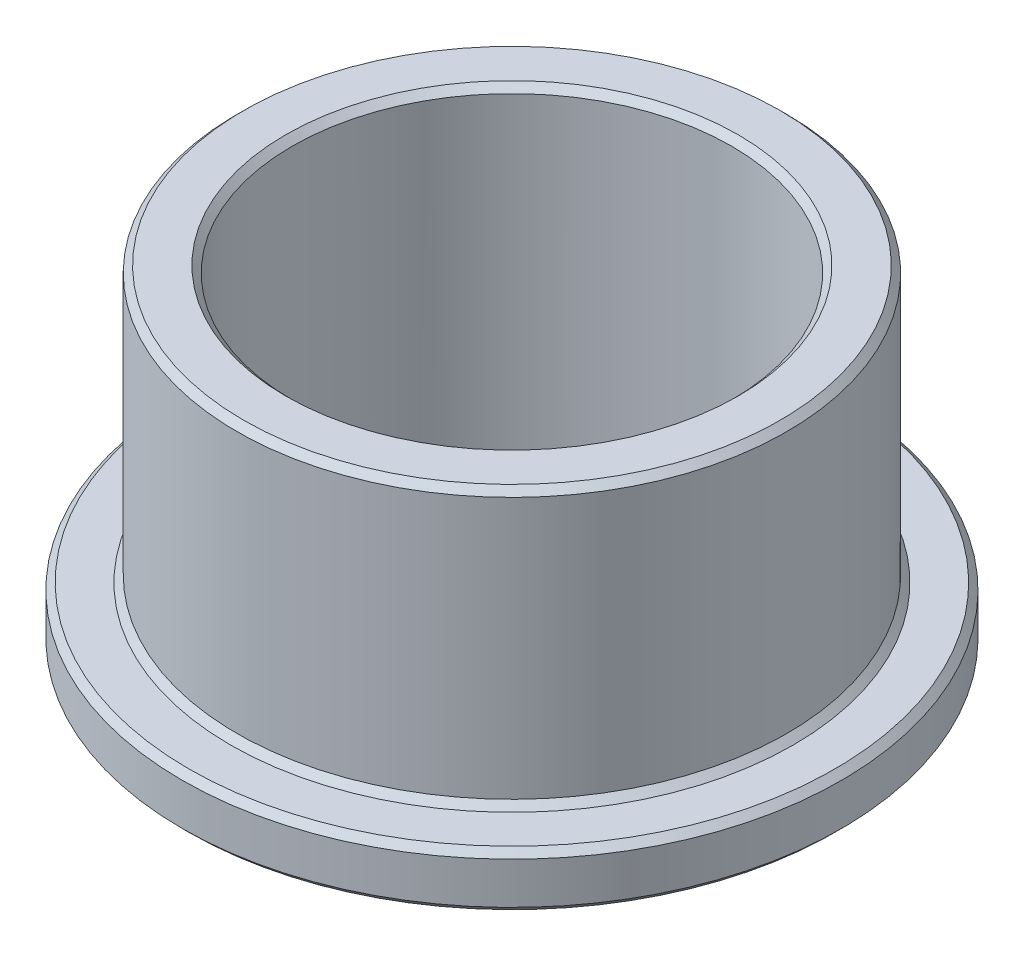
ISO-10303-21;
HEADER;
FILE_DESCRIPTION(('STEP AP214'),'2;1');
FILE_NAME('part.step','',(''),(''),'','','');
FILE_SCHEMA(('AUTOMOTIVE_DESIGN { 1 0 10303 214 1 1 1 1 }'));
ENDSEC;
DATA;
#1=APPLICATION_CONTEXT('core data for automotive mechanical design processes');
#2=APPLICATION_PROTOCOL_DEFINITION('international standard','automotive_design',2000,#1);
#3=PRODUCT_CONTEXT('',#1,'mechanical');
#4=PRODUCT('Part','Part','',(#3));
#5=PRODUCT_RELATED_PRODUCT_CATEGORY('part','',(#4));
#6=PRODUCT_DEFINITION_FORMATION('','',#4);
#7=PRODUCT_DEFINITION_CONTEXT('part definition',#1,'design');
#8=PRODUCT_DEFINITION('design','',#6,#7);
#9=PRODUCT_DEFINITION_SHAPE('','',#8);
#10=(LENGTH_UNIT() NAMED_UNIT(*) SI_UNIT(.MILLI.,.METRE.));
#11=(NAMED_UNIT(*) PLANE_ANGLE_UNIT() SI_UNIT($,.RADIAN.));
#12=(NAMED_UNIT(*) SI_UNIT($,.STERADIAN.) SOLID_ANGLE_UNIT());
#13=UNCERTAINTY_MEASURE_WITH_UNIT(LENGTH_MEASURE(1.E-05),#10,'distance_accuracy_value','');
#14=(GEOMETRIC_REPRESENTATION_CONTEXT(3) GLOBAL_UNCERTAINTY_ASSIGNED_CONTEXT((#13)) GLOBAL_UNIT_ASSIGNED_CONTEXT((#10,
#11,#12)) REPRESENTATION_CONTEXT('',''));
#15=CARTESIAN_POINT('',(0.,0.,0.));
#16=DIRECTION('',(0.,0.,1.));
#17=DIRECTION('',(1.,0.,0.));
#18=AXIS2_PLACEMENT_3D('',#15,#16,#17);
#19=CARTESIAN_POINT('',(-30.3854881364311,3.175,-94.9077592409513));
#20=DIRECTION('',(0.,-1.,0.));
#21=DIRECTION('',(0.,0.,-1.));
#22=AXIS2_PLACEMENT_3D('',#19,#20,#21);
#23=CYLINDRICAL_SURFACE('',#22,19.05);
#24=CARTESIAN_POINT('',(-30.3854881364311,0.381000000000006,-94.9077592409513));
#25=DIRECTION('',(0.,1.,0.));
#26=DIRECTION('',(0.,0.,1.));
#27=AXIS2_PLACEMENT_3D('',#24,#25,#26);
#28=CIRCLE('',#27,19.05);
#29=CARTESIAN_POINT('',(-30.3854881364311,0.381000000000006,-75.8577592409513));
#30=VERTEX_POINT('',#29);
#31=EDGE_CURVE('E72',#30,#30,#28,.T.);
#32=ORIENTED_EDGE('',*,*,#31,.T.);
#33=EDGE_LOOP('',(#32));
#34=FACE_BOUND('',#33,.T.);
#35=CARTESIAN_POINT('',(-30.3854881364311,2.79400000000001,-94.9077592409513));
#36=DIRECTION('',(0.,1.,0.));
#37=DIRECTION('',(0.,0.,1.));
#38=AXIS2_PLACEMENT_3D('',#35,#36,#37);
#39=CIRCLE('',#38,19.05);
#40=CARTESIAN_POINT('',(-30.3854881364311,2.79400000000001,-75.8577592409513));
#41=VERTEX_POINT('',#40);
#42=EDGE_CURVE('E76',#41,#41,#39,.F.);
#43=ORIENTED_EDGE('',*,*,#42,.T.);
#44=EDGE_LOOP('',(#43));
#45=FACE_BOUND('',#44,.T.);
#46=ADVANCED_FACE('F39',(#34,#45),#23,.T.);
#47=CARTESIAN_POINT('',(0.,3.175,0.));
#48=DIRECTION('',(0.,1.,0.));
#49=DIRECTION('',(0.,0.,1.));
#50=AXIS2_PLACEMENT_3D('',#47,#48,#49);
#51=PLANE('',#50);
#52=CARTESIAN_POINT('',(-30.3854881364311,3.175,-94.9077592409513));
#53=DIRECTION('',(0.,1.,0.));
#54=DIRECTION('',(0.,0.,1.));
#55=AXIS2_PLACEMENT_3D('',#52,#53,#54);
#56=CIRCLE('',#55,18.669);
#57=CARTESIAN_POINT('',(-30.3854881364311,3.175,-76.2387592409513));
#58=VERTEX_POINT('',#57);
#59=EDGE_CURVE('E64',#58,#58,#56,.T.);
#60=ORIENTED_EDGE('',*,*,#59,.T.);
#61=EDGE_LOOP('',(#60));
#62=FACE_BOUND('',#61,.T.);
#63=CARTESIAN_POINT('',(-30.3854881364311,3.175,-94.9077592409513));
#64=DIRECTION('',(0.,1.,0.));
#65=DIRECTION('',(0.,0.,1.));
#66=AXIS2_PLACEMENT_3D('',#63,#64,#65);
#67=CIRCLE('',#66,16.2687000000001);
#68=CARTESIAN_POINT('',(-30.3854881364311,3.175,-111.176459240951));
#69=VERTEX_POINT('',#68);
#70=EDGE_CURVE('E68',#69,#69,#67,.F.);
#71=ORIENTED_EDGE('',*,*,#70,.T.);
#72=EDGE_LOOP('',(#71));
#73=FACE_BOUND('',#72,.T.);
#74=ADVANCED_FACE('F109',(#62,#73),#51,.T.);
#75=CARTESIAN_POINT('',(0.,0.,0.));
#76=DIRECTION('',(0.,1.,0.));
#77=DIRECTION('',(0.,0.,1.));
#78=AXIS2_PLACEMENT_3D('',#75,#76,#77);
#79=PLANE('',#78);
#80=CARTESIAN_POINT('',(-30.3854881364311,0.,-94.9077592409513));
#81=DIRECTION('',(0.,1.,0.));
#82=DIRECTION('',(0.,0.,1.));
#83=AXIS2_PLACEMENT_3D('',#80,#81,#82);
#84=CIRCLE('',#83,13.081);
#85=CARTESIAN_POINT('',(-30.3854881364311,0.,-81.8267592409513));
#86=VERTEX_POINT('',#85);
#87=EDGE_CURVE('E88',#86,#86,#84,.T.);
#88=ORIENTED_EDGE('',*,*,#87,.T.);
#89=EDGE_LOOP('',(#88));
#90=FACE_BOUND('',#89,.T.);
#91=CARTESIAN_POINT('',(-30.3854881364311,0.,-94.9077592409513));
#92=DIRECTION('',(0.,1.,0.));
#93=DIRECTION('',(0.,0.,1.));
#94=AXIS2_PLACEMENT_3D('',#91,#92,#93);
#95=CIRCLE('',#94,18.669);
#96=CARTESIAN_POINT('',(-30.3854881364311,0.,-76.2387592409513));
#97=VERTEX_POINT('',#96);
#98=EDGE_CURVE('E92',#97,#97,#95,.F.);
#99=ORIENTED_EDGE('',*,*,#98,.T.);
#100=EDGE_LOOP('',(#99));
#101=FACE_BOUND('',#100,.T.);
#102=ADVANCED_FACE('F97',(#90,#101),#79,.F.);
#103=CARTESIAN_POINT('',(-30.3854881364311,19.05,-94.9077592409513));
#104=DIRECTION('',(0.,-1.,0.));
#105=DIRECTION('',(0.,0.,-1.));
#106=AXIS2_PLACEMENT_3D('',#103,#104,#105);
#107=CYLINDRICAL_SURFACE('',#106,12.7);
#108=CARTESIAN_POINT('',(-30.3854881364311,0.380999999999986,-94.9077592409513));
#109=DIRECTION('',(0.,1.,0.));
#110=DIRECTION('',(0.,0.,1.));
#111=AXIS2_PLACEMENT_3D('',#108,#109,#110);
#112=CIRCLE('',#111,12.7);
#113=CARTESIAN_POINT('',(-30.3854881364311,0.380999999999986,-107.607759240951));
#114=VERTEX_POINT('',#113);
#115=EDGE_CURVE('E80',#114,#114,#112,.F.);
#116=CARTESIAN_POINT('',(-30.3854881364311,18.669,-94.9077592409513));
#117=DIRECTION('',(0.,1.,0.));
#118=DIRECTION('',(0.,0.,1.));
#119=AXIS2_PLACEMENT_3D('',#116,#117,#118);
#120=CIRCLE('',#119,12.7);
#121=CARTESIAN_POINT('',(-30.3854881364311,18.669,-107.607759240951));
#122=VERTEX_POINT('',#121);
#123=EDGE_CURVE('E84',#122,#122,#120,.T.);
#124=CARTESIAN_POINT('',(-30.3854881364311,0.380999999999986,-107.607759240951));
#125=CARTESIAN_POINT('',(-30.3854881364311,0.571499999999985,-107.607759240951));
#126=CARTESIAN_POINT('',(-30.3854881364311,0.761999999999985,-107.607759240951));
#127=CARTESIAN_POINT('',(-30.3854881364311,1.14299999999998,-107.607759240951));
#128=CARTESIAN_POINT('',(-30.3854881364311,1.33349999999998,-107.607759240951));
#129=CARTESIAN_POINT('',(-30.3854881364311,1.71449999999998,-107.607759240951));
#130=CARTESIAN_POINT('',(-30.3854881364311,1.90499999999998,-107.607759240951));
#131=CARTESIAN_POINT('',(-30.3854881364311,2.28599999999998,-107.607759240951));
#132=CARTESIAN_POINT('',(-30.3854881364311,2.47649999999998,-107.607759240951));
#133=CARTESIAN_POINT('',(-30.3854881364311,2.85749999999998,-107.607759240951));
#134=CARTESIAN_POINT('',(-30.3854881364311,3.04799999999998,-107.607759240951));
#135=CARTESIAN_POINT('',(-30.3854881364311,3.42899999999998,-107.607759240951));
#136=CARTESIAN_POINT('',(-30.3854881364311,3.61949999999998,-107.607759240951));
#137=CARTESIAN_POINT('',(-30.3854881364311,4.00049999999998,-107.607759240951));
#138=CARTESIAN_POINT('',(-30.3854881364311,4.19099999999998,-107.607759240951));
#139=CARTESIAN_POINT('',(-30.3854881364311,4.57199999999998,-107.607759240951));
#140=CARTESIAN_POINT('',(-30.3854881364311,4.76249999999998,-107.607759240951));
#141=CARTESIAN_POINT('',(-30.3854881364311,5.14349999999998,-107.607759240951));
#142=CARTESIAN_POINT('',(-30.3854881364311,5.33399999999998,-107.607759240951));
#143=CARTESIAN_POINT('',(-30.3854881364311,5.71499999999997,-107.607759240951));
#144=CARTESIAN_POINT('',(-30.3854881364311,5.90549999999998,-107.607759240951));
#145=CARTESIAN_POINT('',(-30.3854881364311,6.28649999999997,-107.607759240951));
#146=CARTESIAN_POINT('',(-30.3854881364311,6.47699999999997,-107.607759240951));
#147=CARTESIAN_POINT('',(-30.3854881364311,6.85799999999997,-107.607759240951));
#148=CARTESIAN_POINT('',(-30.3854881364311,7.04849999999997,-107.607759240951));
#149=CARTESIAN_POINT('',(-30.3854881364311,7.42949999999997,-107.607759240951));
#150=CARTESIAN_POINT('',(-30.3854881364311,7.61999999999997,-107.607759240951));
#151=CARTESIAN_POINT('',(-30.3854881364311,8.00099999999997,-107.607759240951));
#152=CARTESIAN_POINT('',(-30.3854881364311,8.19149999999997,-107.607759240951));
#153=CARTESIAN_POINT('',(-30.3854881364311,8.57249999999997,-107.607759240951));
#154=CARTESIAN_POINT('',(-30.3854881364311,8.76299999999997,-107.607759240951));
#155=CARTESIAN_POINT('',(-30.3854881364311,9.14399999999997,-107.607759240951));
#156=CARTESIAN_POINT('',(-30.3854881364311,9.33449999999997,-107.607759240951));
#157=CARTESIAN_POINT('',(-30.3854881364311,9.71549999999997,-107.607759240951));
#158=CARTESIAN_POINT('',(-30.3854881364311,9.90599999999997,-107.607759240951));
#159=CARTESIAN_POINT('',(-30.3854881364311,10.287,-107.607759240951));
#160=CARTESIAN_POINT('',(-30.3854881364311,10.4775,-107.607759240951));
#161=CARTESIAN_POINT('',(-30.3854881364311,10.8585,-107.607759240951));
#162=CARTESIAN_POINT('',(-30.3854881364311,11.049,-107.607759240951));
#163=CARTESIAN_POINT('',(-30.3854881364311,11.43,-107.607759240951));
#164=CARTESIAN_POINT('',(-30.3854881364311,11.6205,-107.607759240951));
#165=CARTESIAN_POINT('',(-30.3854881364311,12.0015,-107.607759240951));
#166=CARTESIAN_POINT('',(-30.3854881364311,12.192,-107.607759240951));
#167=CARTESIAN_POINT('',(-30.3854881364311,12.573,-107.607759240951));
#168=CARTESIAN_POINT('',(-30.3854881364311,12.7635,-107.607759240951));
#169=CARTESIAN_POINT('',(-30.3854881364311,13.1445,-107.607759240951));
#170=CARTESIAN_POINT('',(-30.3854881364311,13.335,-107.607759240951));
#171=CARTESIAN_POINT('',(-30.3854881364311,13.716,-107.607759240951));
#172=CARTESIAN_POINT('',(-30.3854881364311,13.9065,-107.607759240951));
#173=CARTESIAN_POINT('',(-30.3854881364311,14.2875,-107.607759240951));
#174=CARTESIAN_POINT('',(-30.3854881364311,14.478,-107.607759240951));
#175=CARTESIAN_POINT('',(-30.3854881364311,14.859,-107.607759240951));
#176=CARTESIAN_POINT('',(-30.3854881364311,15.0495,-107.607759240951));
#177=CARTESIAN_POINT('',(-30.3854881364311,15.4305,-107.607759240951));
#178=CARTESIAN_POINT('',(-30.3854881364311,15.621,-107.607759240951));
#179=CARTESIAN_POINT('',(-30.3854881364311,16.002,-107.607759240951));
#180=CARTESIAN_POINT('',(-30.3854881364311,16.1925,-107.607759240951));
#181=CARTESIAN_POINT('',(-30.3854881364311,16.5735,-107.607759240951));
#182=CARTESIAN_POINT('',(-30.3854881364311,16.764,-107.607759240951));
#183=CARTESIAN_POINT('',(-30.3854881364311,17.145,-107.607759240951));
#184=CARTESIAN_POINT('',(-30.3854881364311,17.3355,-107.607759240951));
#185=CARTESIAN_POINT('',(-30.3854881364311,17.7165,-107.607759240951));
#186=CARTESIAN_POINT('',(-30.3854881364311,17.907,-107.607759240951));
#187=CARTESIAN_POINT('',(-30.3854881364311,18.288,-107.607759240951));
#188=CARTESIAN_POINT('',(-30.3854881364311,18.4785,-107.607759240951));
#189=CARTESIAN_POINT('',(-30.3854881364311,18.669,-107.607759240951));
#190=B_SPLINE_CURVE_WITH_KNOTS('',3,(#124,#125,#126,#127,#128,#129,#130,#131,#132,#133,#134,
#135,#136,#137,#138,#139,#140,#141,#142,#143,#144,#145,#146,#147,#148,#149,#150,#151,#152,#153,
#154,#155,#156,#157,#158,#159,#160,#161,#162,#163,#164,#165,#166,#167,#168,#169,#170,#171,#172,
#173,#174,#175,#176,#177,#178,#179,#180,#181,#182,#183,#184,#185,#186,#187,#188,#189),
.UNSPECIFIED.,.F.,.F.,(4,2,2,2,2,2,2,2,2,2,2,2,2,2,2,2,2,2,2,2,2,2,2,2,2,2,2,2,2,2,2,2,4),(0.,
0.571499999999999,1.143,1.7145,2.286,2.8575,3.42899999999999,4.00049999999999,4.57199999999999,
5.14349999999999,5.71499999999999,6.28649999999999,6.85799999999999,7.42949999999999,
8.00099999999999,8.57249999999998,9.14399999999998,9.71549999999998,10.287,10.8585,11.43,
12.0015,12.573,13.1445,13.716,14.2875,14.859,15.4305,16.002,16.5735,17.145,17.7165,18.288),.UNSPECIFIED.);
#191=EDGE_CURVE('BSEAM134',#114,#122,#190,.T.);
#192=ORIENTED_EDGE('',*,*,#115,.T.);
#193=ORIENTED_EDGE('',*,*,#123,.T.);
#194=ORIENTED_EDGE('',*,*,#191,.T.);
#195=ORIENTED_EDGE('',*,*,#191,.F.);
#196=EDGE_LOOP('',(#192,#194,#193,#195));
#197=FACE_BOUND('',#196,.T.);
#198=ADVANCED_FACE('F134',(#197),#107,.F.);
#199=CARTESIAN_POINT('',(-30.3854881364311,19.05,-94.9077592409513));
#200=DIRECTION('',(0.,-1.,0.));
#201=DIRECTION('',(0.,0.,-1.));
#202=AXIS2_PLACEMENT_3D('',#199,#200,#201);
#203=CYLINDRICAL_SURFACE('',#202,15.8877);
#204=CARTESIAN_POINT('',(-30.3854881364311,3.55600000000006,-94.9077592409513));
#205=DIRECTION('',(0.,1.,0.));
#206=DIRECTION('',(0.,0.,1.));
#207=AXIS2_PLACEMENT_3D('',#204,#205,#206);
#208=CIRCLE('',#207,15.8877);
#209=CARTESIAN_POINT('',(-30.3854881364311,3.55600000000006,-110.795459240951));
#210=VERTEX_POINT('',#209);
#211=EDGE_CURVE('E53',#210,#210,#208,.T.);
#212=CARTESIAN_POINT('',(-30.3854881364311,18.6690000000001,-94.9077592409513));
#213=DIRECTION('',(0.,1.,0.));
#214=DIRECTION('',(0.,0.,1.));
#215=AXIS2_PLACEMENT_3D('',#212,#213,#214);
#216=CIRCLE('',#215,15.8877);
#217=CARTESIAN_POINT('',(-30.3854881364311,18.6690000000001,-110.795459240951));
#218=VERTEX_POINT('',#217);
#219=EDGE_CURVE('E58',#218,#218,#216,.F.);
#220=CARTESIAN_POINT('',(-30.3854881364311,3.55600000000006,-110.795459240951));
#221=CARTESIAN_POINT('',(-30.3854881364311,3.71342708333339,-110.795459240951));
#222=CARTESIAN_POINT('',(-30.3854881364311,3.87085416666673,-110.795459240951));
#223=CARTESIAN_POINT('',(-30.3854881364311,4.18570833333339,-110.795459240951));
#224=CARTESIAN_POINT('',(-30.3854881364311,4.34313541666673,-110.795459240951));
#225=CARTESIAN_POINT('',(-30.3854881364311,4.65798958333339,-110.795459240951));
#226=CARTESIAN_POINT('',(-30.3854881364311,4.81541666666673,-110.795459240951));
#227=CARTESIAN_POINT('',(-30.3854881364311,5.13027083333339,-110.795459240951));
#228=CARTESIAN_POINT('',(-30.3854881364311,5.28769791666673,-110.795459240951));
#229=CARTESIAN_POINT('',(-30.3854881364311,5.60255208333339,-110.795459240951));
#230=CARTESIAN_POINT('',(-30.3854881364311,5.75997916666673,-110.795459240951));
#231=CARTESIAN_POINT('',(-30.3854881364311,6.07483333333339,-110.795459240951));
#232=CARTESIAN_POINT('',(-30.3854881364311,6.23226041666673,-110.795459240951));
#233=CARTESIAN_POINT('',(-30.3854881364311,6.54711458333339,-110.795459240951));
#234=CARTESIAN_POINT('',(-30.3854881364311,6.70454166666673,-110.795459240951));
#235=CARTESIAN_POINT('',(-30.3854881364311,7.01939583333339,-110.795459240951));
#236=CARTESIAN_POINT('',(-30.3854881364311,7.17682291666672,-110.795459240951));
#237=CARTESIAN_POINT('',(-30.3854881364311,7.49167708333339,-110.795459240951));
#238=CARTESIAN_POINT('',(-30.3854881364311,7.64910416666673,-110.795459240951));
#239=CARTESIAN_POINT('',(-30.3854881364311,7.96395833333339,-110.795459240951));
#240=CARTESIAN_POINT('',(-30.3854881364311,8.12138541666672,-110.795459240951));
#241=CARTESIAN_POINT('',(-30.3854881364311,8.43623958333339,-110.795459240951));
#242=CARTESIAN_POINT('',(-30.3854881364311,8.59366666666672,-110.795459240951));
#243=CARTESIAN_POINT('',(-30.3854881364311,8.90852083333339,-110.795459240951));
#244=CARTESIAN_POINT('',(-30.3854881364311,9.06594791666672,-110.795459240951));
#245=CARTESIAN_POINT('',(-30.3854881364311,9.38080208333339,-110.795459240951));
#246=CARTESIAN_POINT('',(-30.3854881364311,9.53822916666672,-110.795459240951));
#247=CARTESIAN_POINT('',(-30.3854881364311,9.85308333333339,-110.795459240951));
#248=CARTESIAN_POINT('',(-30.3854881364311,10.0105104166667,-110.795459240951));
#249=CARTESIAN_POINT('',(-30.3854881364311,10.3253645833334,-110.795459240951));
#250=CARTESIAN_POINT('',(-30.3854881364311,10.4827916666667,-110.795459240951));
#251=CARTESIAN_POINT('',(-30.3854881364311,10.7976458333334,-110.795459240951));
#252=CARTESIAN_POINT('',(-30.3854881364311,10.9550729166667,-110.795459240951));
#253=CARTESIAN_POINT('',(-30.3854881364311,11.2699270833334,-110.795459240951));
#254=CARTESIAN_POINT('',(-30.3854881364311,11.4273541666667,-110.795459240951));
#255=CARTESIAN_POINT('',(-30.3854881364311,11.7422083333334,-110.795459240951));
#256=CARTESIAN_POINT('',(-30.3854881364311,11.8996354166667,-110.795459240951));
#257=CARTESIAN_POINT('',(-30.3854881364311,12.2144895833334,-110.795459240951));
#258=CARTESIAN_POINT('',(-30.3854881364311,12.3719166666667,-110.795459240951));
#259=CARTESIAN_POINT('',(-30.3854881364311,12.6867708333334,-110.795459240951));
#260=CARTESIAN_POINT('',(-30.3854881364311,12.8441979166667,-110.795459240951));
#261=CARTESIAN_POINT('',(-30.3854881364311,13.1590520833334,-110.795459240951));
#262=CARTESIAN_POINT('',(-30.3854881364311,13.3164791666667,-110.795459240951));
#263=CARTESIAN_POINT('',(-30.3854881364311,13.6313333333334,-110.795459240951));
#264=CARTESIAN_POINT('',(-30.3854881364311,13.7887604166667,-110.795459240951));
#265=CARTESIAN_POINT('',(-30.3854881364311,14.1036145833334,-110.795459240951));
#266=CARTESIAN_POINT('',(-30.3854881364311,14.2610416666667,-110.795459240951));
#267=CARTESIAN_POINT('',(-30.3854881364311,14.5758958333334,-110.795459240951));
#268=CARTESIAN_POINT('',(-30.3854881364311,14.7333229166667,-110.795459240951));
#269=CARTESIAN_POINT('',(-30.3854881364311,15.0481770833334,-110.795459240951));
#270=CARTESIAN_POINT('',(-30.3854881364311,15.2056041666667,-110.795459240951));
#271=CARTESIAN_POINT('',(-30.3854881364311,15.5204583333334,-110.795459240951));
#272=CARTESIAN_POINT('',(-30.3854881364311,15.6778854166667,-110.795459240951));
#273=CARTESIAN_POINT('',(-30.3854881364311,15.9927395833334,-110.795459240951));
#274=CARTESIAN_POINT('',(-30.3854881364311,16.1501666666667,-110.795459240951));
#275=CARTESIAN_POINT('',(-30.3854881364311,16.4650208333334,-110.795459240951));
#276=CARTESIAN_POINT('',(-30.3854881364311,16.6224479166667,-110.795459240951));
#277=CARTESIAN_POINT('',(-30.3854881364311,16.9373020833334,-110.795459240951));
#278=CARTESIAN_POINT('',(-30.3854881364311,17.0947291666667,-110.795459240951));
#279=CARTESIAN_POINT('',(-30.3854881364311,17.4095833333334,-110.795459240951));
#280=CARTESIAN_POINT('',(-30.3854881364311,17.5670104166667,-110.795459240951));
#281=CARTESIAN_POINT('',(-30.3854881364311,17.8818645833334,-110.795459240951));
#282=CARTESIAN_POINT('',(-30.3854881364311,18.0392916666667,-110.795459240951));
#283=CARTESIAN_POINT('',(-30.3854881364311,18.3541458333334,-110.795459240951));
#284=CARTESIAN_POINT('',(-30.3854881364311,18.5115729166667,-110.795459240951));
#285=CARTESIAN_POINT('',(-30.3854881364311,18.6690000000001,-110.795459240951));
#286=B_SPLINE_CURVE_WITH_KNOTS('',3,(#220,#221,#222,#223,#224,#225,#226,#227,#228,#229,#230,
#231,#232,#233,#234,#235,#236,#237,#238,#239,#240,#241,#242,#243,#244,#245,#246,#247,#248,#249,
#250,#251,#252,#253,#254,#255,#256,#257,#258,#259,#260,#261,#262,#263,#264,#265,#266,#267,#268,
#269,#270,#271,#272,#273,#274,#275,#276,#277,#278,#279,#280,#281,#282,#283,#284,#285),
.UNSPECIFIED.,.F.,.F.,(4,2,2,2,2,2,2,2,2,2,2,2,2,2,2,2,2,2,2,2,2,2,2,2,2,2,2,2,2,2,2,2,4),(0.,
0.47228125,0.944562499999999,1.41684375,1.889125,2.36140625,2.8336875,3.30596875,3.77825,
4.25053125,4.7228125,5.19509375,5.667375,6.13965625,6.61193749999999,7.08421875,
7.55649999999999,8.02878124999999,8.50106249999999,8.97334374999999,9.44562499999999,
9.91790624999999,10.3901875,10.86246875,11.33475,11.80703125,12.2793125,12.75159375,13.223875,
13.69615625,14.1684375,14.64071875,15.113),.UNSPECIFIED.);
#287=EDGE_CURVE('BSEAM130',#210,#218,#286,.T.);
#288=ORIENTED_EDGE('',*,*,#211,.T.);
#289=ORIENTED_EDGE('',*,*,#219,.T.);
#290=ORIENTED_EDGE('',*,*,#287,.T.);
#291=ORIENTED_EDGE('',*,*,#287,.F.);
#292=EDGE_LOOP('',(#288,#290,#289,#291));
#293=FACE_BOUND('',#292,.T.);
#294=ADVANCED_FACE('F130',(#293),#203,.T.);
#295=CARTESIAN_POINT('',(0.,19.05,0.));
#296=DIRECTION('',(0.,1.,0.));
#297=DIRECTION('',(0.,0.,1.));
#298=AXIS2_PLACEMENT_3D('',#295,#296,#297);
#299=PLANE('',#298);
#300=CARTESIAN_POINT('',(-30.3854881364311,19.05,-94.9077592409513));
#301=DIRECTION('',(0.,1.,0.));
#302=DIRECTION('',(0.,0.,1.));
#303=AXIS2_PLACEMENT_3D('',#300,#301,#302);
#304=CIRCLE('',#303,13.081);
#305=CARTESIAN_POINT('',(-30.3854881364311,19.05,-81.8267592409513));
#306=VERTEX_POINT('',#305);
#307=EDGE_CURVE('E10',#306,#306,#304,.F.);
#308=ORIENTED_EDGE('',*,*,#307,.T.);
#309=EDGE_LOOP('',(#308));
#310=FACE_BOUND('',#309,.T.);
#311=CARTESIAN_POINT('',(-30.3854881364311,19.05,-94.9077592409513));
#312=DIRECTION('',(0.,1.,0.));
#313=DIRECTION('',(0.,0.,1.));
#314=AXIS2_PLACEMENT_3D('',#311,#312,#313);
#315=CIRCLE('',#314,15.5067);
#316=CARTESIAN_POINT('',(-30.3854881364311,19.05,-79.4010592409513));
#317=VERTEX_POINT('',#316);
#318=EDGE_CURVE('E48',#317,#317,#315,.T.);
#319=ORIENTED_EDGE('',*,*,#318,.T.);
#320=EDGE_LOOP('',(#319));
#321=FACE_BOUND('',#320,.T.);
#322=ADVANCED_FACE('F133',(#310,#321),#299,.T.);
#323=CARTESIAN_POINT('',(-30.3854881364311,0.,-94.9077592409513));
#324=DIRECTION('',(0.,-1.,0.));
#325=DIRECTION('',(0.,0.,-1.));
#326=AXIS2_PLACEMENT_3D('',#323,#324,#325);
#327=CONICAL_SURFACE('',#326,13.081,0.785398163397462);
#328=ORIENTED_EDGE('',*,*,#115,.F.);
#329=EDGE_LOOP('',(#328));
#330=FACE_BOUND('',#329,.T.);
#331=ORIENTED_EDGE('',*,*,#87,.F.);
#332=EDGE_LOOP('',(#331));
#333=FACE_BOUND('',#332,.T.);
#334=ADVANCED_FACE('F103',(#330,#333),#327,.F.);
#335=CARTESIAN_POINT('',(-30.3854881364311,0.381000000000006,-94.9077592409513));
#336=DIRECTION('',(0.,1.,0.));
#337=DIRECTION('',(0.,0.,1.));
#338=AXIS2_PLACEMENT_3D('',#335,#336,#337);
#339=CONICAL_SURFACE('',#338,19.05,0.785398163397448);
#340=CARTESIAN_POINT('',(-30.3854881364311,0.,-76.2387592409513));
#341=CARTESIAN_POINT('',(-30.3854881364311,0.00396875000000001,-76.2347904909513));
#342=CARTESIAN_POINT('',(-30.3854881364311,0.00793750000000007,-76.2308217409513));
#343=CARTESIAN_POINT('',(-30.3854881364311,0.0158750000000002,-76.2228842409513));
#344=CARTESIAN_POINT('',(-30.3854881364311,0.0198437500000003,-76.2189154909513));
#345=CARTESIAN_POINT('',(-30.3854881364311,0.0277812500000004,-76.2109779909513));
#346=CARTESIAN_POINT('',(-30.3854881364311,0.0317500000000004,-76.2070092409513));
#347=CARTESIAN_POINT('',(-30.3854881364311,0.0396875000000006,-76.1990717409513));
#348=CARTESIAN_POINT('',(-30.3854881364311,0.0436562500000008,-76.1951029909513));
#349=CARTESIAN_POINT('',(-30.3854881364311,0.0515937500000007,-76.1871654909513));
#350=CARTESIAN_POINT('',(-30.3854881364311,0.0555625000000005,-76.1831967409513));
#351=CARTESIAN_POINT('',(-30.3854881364311,0.0635000000000014,-76.1752592409513));
#352=CARTESIAN_POINT('',(-30.3854881364311,0.0674687500000025,-76.1712904909513));
#353=CARTESIAN_POINT('',(-30.3854881364311,0.075406250000002,-76.1633529909513));
#354=CARTESIAN_POINT('',(-30.3854881364311,0.0793750000000004,-76.1593842409513));
#355=CARTESIAN_POINT('',(-30.3854881364311,0.0873124999999999,-76.1514467409513));
#356=CARTESIAN_POINT('',(-30.3854881364311,0.0912812500000011,-76.1474779909513));
#357=CARTESIAN_POINT('',(-30.3854881364311,0.099218750000002,-76.1395404909513));
#358=CARTESIAN_POINT('',(-30.3854881364311,0.103187500000002,-76.1355717409513));
#359=CARTESIAN_POINT('',(-30.3854881364311,0.111125000000002,-76.1276342409513));
#360=CARTESIAN_POINT('',(-30.3854881364311,0.115093750000002,-76.1236654909513));
#361=CARTESIAN_POINT('',(-30.3854881364311,0.123031250000002,-76.1157279909513));
#362=CARTESIAN_POINT('',(-30.3854881364311,0.127000000000002,-76.1117592409513));
#363=CARTESIAN_POINT('',(-30.3854881364311,0.134937500000002,-76.1038217409513));
#364=CARTESIAN_POINT('',(-30.3854881364311,0.138906250000002,-76.0998529909513));
#365=CARTESIAN_POINT('',(-30.3854881364311,0.146843750000002,-76.0919154909513));
#366=CARTESIAN_POINT('',(-30.3854881364311,0.150812500000002,-76.0879467409513));
#367=CARTESIAN_POINT('',(-30.3854881364311,0.158750000000003,-76.0800092409513));
#368=CARTESIAN_POINT('',(-30.3854881364311,0.162718750000004,-76.0760404909513));
#369=CARTESIAN_POINT('',(-30.3854881364311,0.170656250000004,-76.0681029909513));
#370=CARTESIAN_POINT('',(-30.3854881364311,0.174625000000002,-76.0641342409513));
#371=CARTESIAN_POINT('',(-30.3854881364311,0.182562500000002,-76.0561967409513));
#372=CARTESIAN_POINT('',(-30.3854881364311,0.186531250000003,-76.0522279909513));
#373=CARTESIAN_POINT('',(-30.3854881364311,0.194468750000004,-76.0442904909513));
#374=CARTESIAN_POINT('',(-30.3854881364311,0.198437500000003,-76.0403217409513));
#375=CARTESIAN_POINT('',(-30.3854881364311,0.206375000000003,-76.0323842409513));
#376=CARTESIAN_POINT('',(-30.3854881364311,0.210343750000003,-76.0284154909513));
#377=CARTESIAN_POINT('',(-30.3854881364311,0.218281250000004,-76.0204779909513));
#378=CARTESIAN_POINT('',(-30.3854881364311,0.222250000000004,-76.0165092409513));
#379=CARTESIAN_POINT('',(-30.3854881364311,0.230187500000004,-76.0085717409513));
#380=CARTESIAN_POINT('',(-30.3854881364311,0.234156250000004,-76.0046029909513));
#381=CARTESIAN_POINT('',(-30.3854881364311,0.242093750000004,-75.9966654909513));
#382=CARTESIAN_POINT('',(-30.3854881364311,0.246062500000004,-75.9926967409513));
#383=CARTESIAN_POINT('',(-30.3854881364311,0.254000000000004,-75.9847592409513));
#384=CARTESIAN_POINT('',(-30.3854881364311,0.257968750000004,-75.9807904909513));
#385=CARTESIAN_POINT('',(-30.3854881364311,0.265906250000004,-75.9728529909513));
#386=CARTESIAN_POINT('',(-30.3854881364311,0.269875000000004,-75.9688842409513));
#387=CARTESIAN_POINT('',(-30.3854881364311,0.277812500000005,-75.9609467409513));
#388=CARTESIAN_POINT('',(-30.3854881364311,0.281781250000005,-75.9569779909513));
#389=CARTESIAN_POINT('',(-30.3854881364311,0.289718750000005,-75.9490404909513));
#390=CARTESIAN_POINT('',(-30.3854881364311,0.293687500000005,-75.9450717409513));
#391=CARTESIAN_POINT('',(-30.3854881364311,0.301625000000005,-75.9371342409513));
#392=CARTESIAN_POINT('',(-30.3854881364311,0.305593750000005,-75.9331654909513));
#393=CARTESIAN_POINT('',(-30.3854881364311,0.313531250000005,-75.9252279909513));
#394=CARTESIAN_POINT('',(-30.3854881364311,0.317500000000005,-75.9212592409513));
#395=CARTESIAN_POINT('',(-30.3854881364311,0.325437500000006,-75.9133217409513));
#396=CARTESIAN_POINT('',(-30.3854881364311,0.329406250000007,-75.9093529909513));
#397=CARTESIAN_POINT('',(-30.3854881364311,0.337343750000006,-75.9014154909513));
#398=CARTESIAN_POINT('',(-30.3854881364311,0.341312500000005,-75.8974467409513));
#399=CARTESIAN_POINT('',(-30.3854881364311,0.349250000000004,-75.8895092409513));
#400=CARTESIAN_POINT('',(-30.3854881364311,0.353218750000005,-75.8855404909513));
#401=CARTESIAN_POINT('',(-30.3854881364311,0.361156250000006,-75.8776029909513));
#402=CARTESIAN_POINT('',(-30.3854881364311,0.365125000000006,-75.8736342409513));
#403=CARTESIAN_POINT('',(-30.3854881364311,0.373062500000006,-75.8656967409513));
#404=CARTESIAN_POINT('',(-30.3854881364311,0.377031250000006,-75.8617279909513));
#405=CARTESIAN_POINT('',(-30.3854881364311,0.381000000000006,-75.8577592409513));
#406=B_SPLINE_CURVE_WITH_KNOTS('',3,(#340,#341,#342,#343,#344,#345,#346,#347,#348,#349,#350,
#351,#352,#353,#354,#355,#356,#357,#358,#359,#360,#361,#362,#363,#364,#365,#366,#367,#368,#369,
#370,#371,#372,#373,#374,#375,#376,#377,#378,#379,#380,#381,#382,#383,#384,#385,#386,#387,#388,
#389,#390,#391,#392,#393,#394,#395,#396,#397,#398,#399,#400,#401,#402,#403,#404,#405),
.UNSPECIFIED.,.F.,.F.,(4,2,2,2,2,2,2,2,2,2,2,2,2,2,2,2,2,2,2,2,2,2,2,2,2,2,2,2,2,2,2,2,4),(0.,
0.016837980227004,0.033675960454008,0.0505139406810121,0.0673519209080161,0.0841899011350201,
0.101027881362024,0.117865861589038,0.134703841816042,0.151541822043046,0.16837980227005,
0.185217782497054,0.202055762724058,0.218893742951062,0.235731723178066,0.25256970340508,
0.269407683632084,0.286245663859088,0.303083644086092,0.319921624313096,0.3367596045401,
0.353597584767104,0.370435564994108,0.387273545221112,0.404111525448116,0.42094950567512,
0.437787485902124,0.454625466129128,0.471463446356132,0.488301426583146,0.50513940681015,
0.521977387037154,0.538815367264158),.UNSPECIFIED.);
#407=EDGE_CURVE('BSEAM99',#97,#30,#406,.T.);
#408=ORIENTED_EDGE('',*,*,#98,.F.);
#409=ORIENTED_EDGE('',*,*,#31,.F.);
#410=ORIENTED_EDGE('',*,*,#407,.T.);
#411=ORIENTED_EDGE('',*,*,#407,.F.);
#412=EDGE_LOOP('',(#408,#410,#409,#411));
#413=FACE_BOUND('',#412,.T.);
#414=ADVANCED_FACE('F99',(#413),#339,.T.);
#415=CARTESIAN_POINT('',(-30.3854881364311,3.175,-94.9077592409513));
#416=DIRECTION('',(0.,-1.,0.));
#417=DIRECTION('',(0.,0.,-1.));
#418=AXIS2_PLACEMENT_3D('',#415,#416,#417);
#419=CONICAL_SURFACE('',#418,18.669,0.785398163397435);
#420=ORIENTED_EDGE('',*,*,#42,.F.);
#421=EDGE_LOOP('',(#420));
#422=FACE_BOUND('',#421,.T.);
#423=ORIENTED_EDGE('',*,*,#59,.F.);
#424=EDGE_LOOP('',(#423));
#425=FACE_BOUND('',#424,.T.);
#426=ADVANCED_FACE('F102',(#422,#425),#419,.T.);
#427=CARTESIAN_POINT('',(-30.3854881364311,3.55600000000006,-94.9077592409513));
#428=DIRECTION('',(0.,-1.,0.));
#429=DIRECTION('',(0.,0.,-1.));
#430=AXIS2_PLACEMENT_3D('',#427,#428,#429);
#431=CONICAL_SURFACE('',#430,15.8877,0.785398163397439);
#432=CARTESIAN_POINT('',(-30.3854881364311,3.175,-111.176459240951));
#433=CARTESIAN_POINT('',(-30.3854881364311,3.17896875,-111.172490490951));
#434=CARTESIAN_POINT('',(-30.3854881364311,3.1829375,-111.168521740951));
#435=CARTESIAN_POINT('',(-30.3854881364311,3.190875,-111.160584240951));
#436=CARTESIAN_POINT('',(-30.3854881364311,3.19484375,-111.156615490951));
#437=CARTESIAN_POINT('',(-30.3854881364311,3.20278125,-111.148677990951));
#438=CARTESIAN_POINT('',(-30.3854881364311,3.20675000000001,-111.144709240951));
#439=CARTESIAN_POINT('',(-30.3854881364311,3.21468750000001,-111.136771740951));
#440=CARTESIAN_POINT('',(-30.3854881364311,3.21865625000001,-111.132802990951));
#441=CARTESIAN_POINT('',(-30.3854881364311,3.22659375000001,-111.124865490951));
#442=CARTESIAN_POINT('',(-30.3854881364311,3.23056250000001,-111.120896740951));
#443=CARTESIAN_POINT('',(-30.3854881364311,3.23850000000001,-111.112959240951));
#444=CARTESIAN_POINT('',(-30.3854881364311,3.24246875000001,-111.108990490951));
#445=CARTESIAN_POINT('',(-30.3854881364311,3.25040625000001,-111.101052990951));
#446=CARTESIAN_POINT('',(-30.3854881364311,3.25437500000001,-111.097084240951));
#447=CARTESIAN_POINT('',(-30.3854881364311,3.26231250000001,-111.089146740951));
#448=CARTESIAN_POINT('',(-30.3854881364311,3.26628125000001,-111.085177990951));
#449=CARTESIAN_POINT('',(-30.3854881364311,3.27421875000001,-111.077240490951));
#450=CARTESIAN_POINT('',(-30.3854881364311,3.27818750000002,-111.073271740951));
#451=CARTESIAN_POINT('',(-30.3854881364311,3.28612500000002,-111.065334240951));
#452=CARTESIAN_POINT('',(-30.3854881364311,3.29009375000002,-111.061365490951));
#453=CARTESIAN_POINT('',(-30.3854881364311,3.29803125000002,-111.053427990951));
#454=CARTESIAN_POINT('',(-30.3854881364311,3.30200000000002,-111.049459240951));
#455=CARTESIAN_POINT('',(-30.3854881364311,3.30993750000002,-111.041521740951));
#456=CARTESIAN_POINT('',(-30.3854881364311,3.31390625000002,-111.037552990951));
#457=CARTESIAN_POINT('',(-30.3854881364311,3.32184375000002,-111.029615490951));
#458=CARTESIAN_POINT('',(-30.3854881364311,3.32581250000003,-111.025646740951));
#459=CARTESIAN_POINT('',(-30.3854881364311,3.33375000000003,-111.017709240951));
#460=CARTESIAN_POINT('',(-30.3854881364311,3.33771875000003,-111.013740490951));
#461=CARTESIAN_POINT('',(-30.3854881364311,3.34565625000003,-111.005802990951));
#462=CARTESIAN_POINT('',(-30.3854881364311,3.34962500000003,-111.001834240951));
#463=CARTESIAN_POINT('',(-30.3854881364311,3.35756250000003,-110.993896740951));
#464=CARTESIAN_POINT('',(-30.3854881364311,3.36153125000003,-110.989927990951));
#465=CARTESIAN_POINT('',(-30.3854881364311,3.36946875000003,-110.981990490951));
#466=CARTESIAN_POINT('',(-30.3854881364311,3.37343750000003,-110.978021740951));
#467=CARTESIAN_POINT('',(-30.3854881364311,3.38137500000003,-110.970084240951));
#468=CARTESIAN_POINT('',(-30.3854881364311,3.38534375000003,-110.966115490951));
#469=CARTESIAN_POINT('',(-30.3854881364311,3.39328125000004,-110.958177990951));
#470=CARTESIAN_POINT('',(-30.3854881364311,3.39725000000004,-110.954209240951));
#471=CARTESIAN_POINT('',(-30.3854881364311,3.40518750000004,-110.946271740951));
#472=CARTESIAN_POINT('',(-30.3854881364311,3.40915625000004,-110.942302990951));
#473=CARTESIAN_POINT('',(-30.3854881364311,3.41709375000004,-110.934365490951));
#474=CARTESIAN_POINT('',(-30.3854881364311,3.42106250000004,-110.930396740951));
#475=CARTESIAN_POINT('',(-30.3854881364311,3.42900000000004,-110.922459240951));
#476=CARTESIAN_POINT('',(-30.3854881364311,3.43296875000004,-110.918490490951));
#477=CARTESIAN_POINT('',(-30.3854881364311,3.44090625000004,-110.910552990951));
#478=CARTESIAN_POINT('',(-30.3854881364311,3.44487500000004,-110.906584240951));
#479=CARTESIAN_POINT('',(-30.3854881364311,3.45281250000004,-110.898646740951));
#480=CARTESIAN_POINT('',(-30.3854881364311,3.45678125000005,-110.894677990951));
#481=CARTESIAN_POINT('',(-30.3854881364311,3.46471875000005,-110.886740490951));
#482=CARTESIAN_POINT('',(-30.3854881364311,3.46868750000005,-110.882771740951));
#483=CARTESIAN_POINT('',(-30.3854881364311,3.47662500000005,-110.874834240951));
#484=CARTESIAN_POINT('',(-30.3854881364311,3.48059375000005,-110.870865490951));
#485=CARTESIAN_POINT('',(-30.3854881364311,3.48853125000005,-110.862927990951));
#486=CARTESIAN_POINT('',(-30.3854881364311,3.49250000000005,-110.858959240951));
#487=CARTESIAN_POINT('',(-30.3854881364311,3.50043750000005,-110.851021740951));
#488=CARTESIAN_POINT('',(-30.3854881364311,3.50440625000005,-110.847052990951));
#489=CARTESIAN_POINT('',(-30.3854881364311,3.51234375000006,-110.839115490951));
#490=CARTESIAN_POINT('',(-30.3854881364311,3.51631250000006,-110.835146740951));
#491=CARTESIAN_POINT('',(-30.3854881364311,3.52425000000006,-110.827209240951));
#492=CARTESIAN_POINT('',(-30.3854881364311,3.52821875000006,-110.823240490951));
#493=CARTESIAN_POINT('',(-30.3854881364311,3.53615625000006,-110.815302990951));
#494=CARTESIAN_POINT('',(-30.3854881364311,3.54012500000006,-110.811334240951));
#495=CARTESIAN_POINT('',(-30.3854881364311,3.54806250000006,-110.803396740951));
#496=CARTESIAN_POINT('',(-30.3854881364311,3.55203125000006,-110.799427990951));
#497=CARTESIAN_POINT('',(-30.3854881364311,3.55600000000006,-110.795459240951));
#498=B_SPLINE_CURVE_WITH_KNOTS('',3,(#432,#433,#434,#435,#436,#437,#438,#439,#440,#441,#442,
#443,#444,#445,#446,#447,#448,#449,#450,#451,#452,#453,#454,#455,#456,#457,#458,#459,#460,#461,
#462,#463,#464,#465,#466,#467,#468,#469,#470,#471,#472,#473,#474,#475,#476,#477,#478,#479,#480,
#481,#482,#483,#484,#485,#486,#487,#488,#489,#490,#491,#492,#493,#494,#495,#496,#497),
.UNSPECIFIED.,.F.,.F.,(4,2,2,2,2,2,2,2,2,2,2,2,2,2,2,2,2,2,2,2,2,2,2,2,2,2,2,2,2,2,2,2,4),(0.,
0.0168379802270053,0.0336759604540108,0.0505139406810161,0.0673519209080311,0.0841899011350364,
0.101027881362042,0.117865861589047,0.134703841816062,0.151541822043067,0.168379802270072,
0.185217782497078,0.202055762724083,0.218893742951088,0.235731723178103,0.252569703405108,
0.269407683632114,0.286245663859129,0.303083644086134,0.31992162431314,0.336759604540145,
0.35359758476715,0.370435564994155,0.387273545221171,0.404111525448176,0.420949505675181,
0.437787485902186,0.454625466129201,0.471463446356207,0.488301426583212,0.505139406810217,
0.521977387037222,0.538815367264228),.UNSPECIFIED.);
#499=EDGE_CURVE('BSEAM115',#69,#210,#498,.T.);
#500=ORIENTED_EDGE('',*,*,#70,.F.);
#501=ORIENTED_EDGE('',*,*,#211,.F.);
#502=ORIENTED_EDGE('',*,*,#499,.T.);
#503=ORIENTED_EDGE('',*,*,#499,.F.);
#504=EDGE_LOOP('',(#500,#502,#501,#503));
#505=FACE_BOUND('',#504,.T.);
#506=ADVANCED_FACE('F115',(#505),#431,.T.);
#507=CARTESIAN_POINT('',(-30.3854881364311,18.669,-94.9077592409513));
#508=DIRECTION('',(0.,1.,0.));
#509=DIRECTION('',(0.,0.,1.));
#510=AXIS2_PLACEMENT_3D('',#507,#508,#509);
#511=CONICAL_SURFACE('',#510,12.7,0.785398163397435);
#512=ORIENTED_EDGE('',*,*,#307,.F.);
#513=EDGE_LOOP('',(#512));
#514=FACE_BOUND('',#513,.T.);
#515=ORIENTED_EDGE('',*,*,#123,.F.);
#516=EDGE_LOOP('',(#515));
#517=FACE_BOUND('',#516,.T.);
#518=ADVANCED_FACE('F126',(#514,#517),#511,.F.);
#519=CARTESIAN_POINT('',(-30.3854881364311,19.05,-94.9077592409513));
#520=DIRECTION('',(0.,-1.,0.));
#521=DIRECTION('',(0.,0.,-1.));
#522=AXIS2_PLACEMENT_3D('',#519,#520,#521);
#523=CONICAL_SURFACE('',#522,15.5067,0.785398163397457);
#524=ORIENTED_EDGE('',*,*,#219,.F.);
#525=EDGE_LOOP('',(#524));
#526=FACE_BOUND('',#525,.T.);
#527=ORIENTED_EDGE('',*,*,#318,.F.);
#528=EDGE_LOOP('',(#527));
#529=FACE_BOUND('',#528,.T.);
#530=ADVANCED_FACE('F42',(#526,#529),#523,.T.);
#531=CLOSED_SHELL('',(#46,#74,#102,#198,#294,#322,#334,#414,#426,#506,#518,#530));
#532=MANIFOLD_SOLID_BREP('B2',#531);
#533=ADVANCED_BREP_SHAPE_REPRESENTATION('',(#18,#532),#14);
#534=SHAPE_DEFINITION_REPRESENTATION(#9,#533);
ENDSEC;
END-ISO-10303-21;
